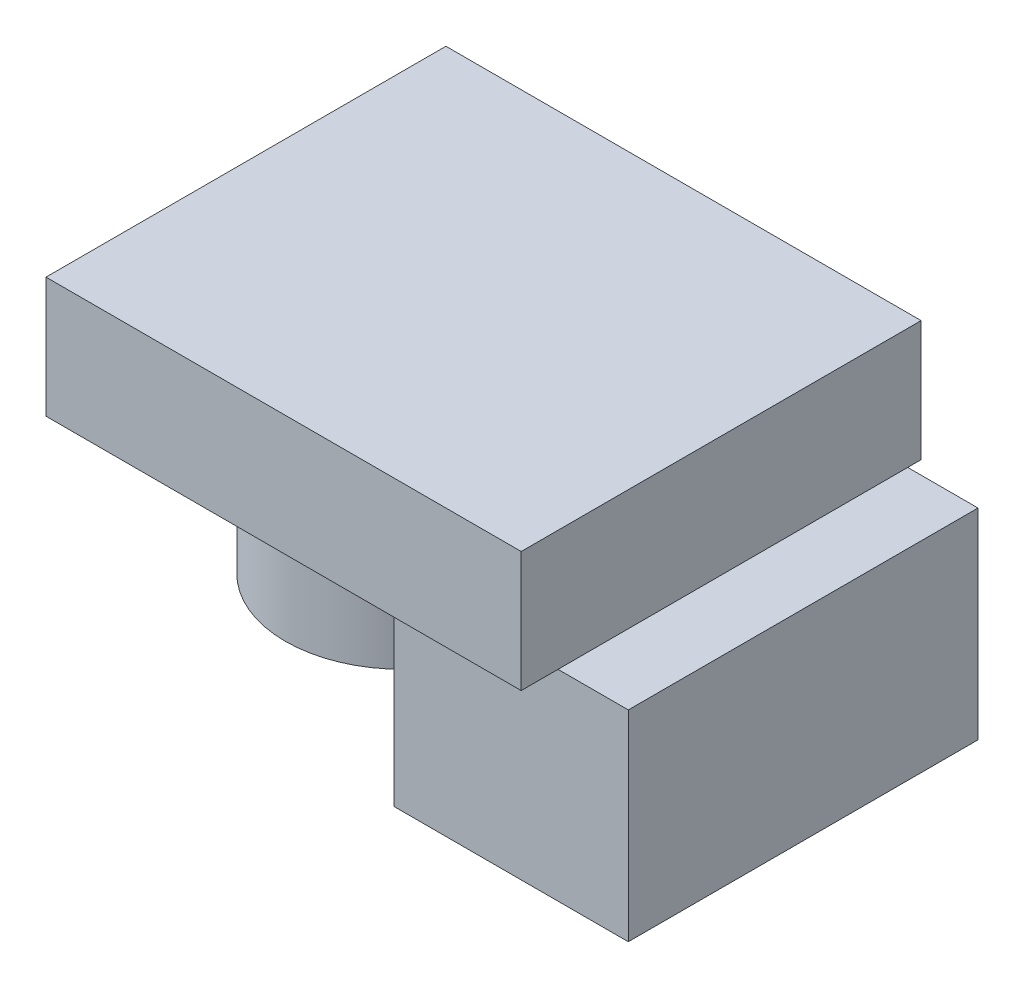
ISO-10303-21;
HEADER;
FILE_DESCRIPTION(('STEP AP214'),'2;1');
FILE_NAME('part.step','',(''),(''),'','','');
FILE_SCHEMA(('AUTOMOTIVE_DESIGN { 1 0 10303 214 1 1 1 1 }'));
ENDSEC;
DATA;
#1=APPLICATION_CONTEXT('core data for automotive mechanical design processes');
#2=APPLICATION_PROTOCOL_DEFINITION('international standard','automotive_design',2000,#1);
#3=PRODUCT_CONTEXT('',#1,'mechanical');
#4=PRODUCT('Part','Part','',(#3));
#5=PRODUCT_RELATED_PRODUCT_CATEGORY('part','',(#4));
#6=PRODUCT_DEFINITION_FORMATION('','',#4);
#7=PRODUCT_DEFINITION_CONTEXT('part definition',#1,'design');
#8=PRODUCT_DEFINITION('design','',#6,#7);
#9=PRODUCT_DEFINITION_SHAPE('','',#8);
#10=(LENGTH_UNIT() NAMED_UNIT(*) SI_UNIT(.MILLI.,.METRE.));
#11=(NAMED_UNIT(*) PLANE_ANGLE_UNIT() SI_UNIT($,.RADIAN.));
#12=(NAMED_UNIT(*) SI_UNIT($,.STERADIAN.) SOLID_ANGLE_UNIT());
#13=UNCERTAINTY_MEASURE_WITH_UNIT(LENGTH_MEASURE(1.E-05),#10,'distance_accuracy_value','');
#14=(GEOMETRIC_REPRESENTATION_CONTEXT(3) GLOBAL_UNCERTAINTY_ASSIGNED_CONTEXT((#13)) GLOBAL_UNIT_ASSIGNED_CONTEXT((#10,
#11,#12)) REPRESENTATION_CONTEXT('',''));
#15=CARTESIAN_POINT('',(0.,0.,0.));
#16=DIRECTION('',(0.,0.,1.));
#17=DIRECTION('',(1.,0.,0.));
#18=AXIS2_PLACEMENT_3D('',#15,#16,#17);
#19=CARTESIAN_POINT('',(0.,5.5,0.));
#20=DIRECTION('',(0.,1.,0.));
#21=DIRECTION('',(0.,0.,1.));
#22=AXIS2_PLACEMENT_3D('',#19,#20,#21);
#23=PLANE('',#22);
#24=CARTESIAN_POINT('',(0.,5.5,0.));
#25=DIRECTION('',(0.,1.,0.));
#26=DIRECTION('',(0.,0.,1.));
#27=AXIS2_PLACEMENT_3D('',#24,#25,#26);
#28=CIRCLE('',#27,3.5);
#29=CARTESIAN_POINT('',(0.,5.5,3.5));
#30=VERTEX_POINT('',#29);
#31=EDGE_CURVE('E54',#30,#30,#28,.T.);
#32=ORIENTED_EDGE('',*,*,#31,.T.);
#33=EDGE_LOOP('',(#32));
#34=FACE_BOUND('',#33,.T.);
#35=DIRECTION('',(-1.,0.,0.));
#36=VECTOR('',#35,1.);
#37=CARTESIAN_POINT('',(5.4,5.5,5.65));
#38=LINE('',#37,#36);
#39=CARTESIAN_POINT('',(10.3,5.5,5.65));
#40=VERTEX_POINT('',#39);
#41=CARTESIAN_POINT('',(5.4,5.5,5.65));
#42=VERTEX_POINT('',#41);
#43=EDGE_CURVE('E11',#40,#42,#38,.T.);
#44=ORIENTED_EDGE('',*,*,#43,.F.);
#45=DIRECTION('',(0.,0.,-1.));
#46=VECTOR('',#45,1.);
#47=CARTESIAN_POINT('',(10.3,5.5,-5.2));
#48=LINE('',#47,#46);
#49=CARTESIAN_POINT('',(10.3,5.5,6.75));
#50=VERTEX_POINT('',#49);
#51=EDGE_CURVE('E172',#50,#40,#48,.T.);
#52=ORIENTED_EDGE('',*,*,#51,.F.);
#53=DIRECTION('',(1.,0.,0.));
#54=VECTOR('',#53,1.);
#55=CARTESIAN_POINT('',(-3.9,5.5,6.75));
#56=LINE('',#55,#54);
#57=CARTESIAN_POINT('',(-3.9,5.5,6.75));
#58=VERTEX_POINT('',#57);
#59=EDGE_CURVE('E146',#58,#50,#56,.T.);
#60=ORIENTED_EDGE('',*,*,#59,.F.);
#61=DIRECTION('',(0.,0.,1.));
#62=VECTOR('',#61,1.);
#63=CARTESIAN_POINT('',(-3.9,5.5,-5.2));
#64=LINE('',#63,#62);
#65=CARTESIAN_POINT('',(-3.9,5.5,-5.2));
#66=VERTEX_POINT('',#65);
#67=EDGE_CURVE('E141',#66,#58,#64,.T.);
#68=ORIENTED_EDGE('',*,*,#67,.F.);
#69=DIRECTION('',(-1.,0.,0.));
#70=VECTOR('',#69,1.);
#71=CARTESIAN_POINT('',(-3.9,5.5,-5.2));
#72=LINE('',#71,#70);
#73=CARTESIAN_POINT('',(10.3,5.5,-5.2));
#74=VERTEX_POINT('',#73);
#75=EDGE_CURVE('E157',#74,#66,#72,.T.);
#76=ORIENTED_EDGE('',*,*,#75,.F.);
#77=CARTESIAN_POINT('',(10.3,5.5,-4.8));
#78=VERTEX_POINT('',#77);
#79=EDGE_CURVE('E67',#78,#74,#48,.T.);
#80=ORIENTED_EDGE('',*,*,#79,.F.);
#81=DIRECTION('',(1.,0.,0.));
#82=VECTOR('',#81,1.);
#83=CARTESIAN_POINT('',(5.4,5.5,-4.8));
#84=LINE('',#83,#82);
#85=CARTESIAN_POINT('',(5.4,5.5,-4.8));
#86=VERTEX_POINT('',#85);
#87=EDGE_CURVE('E258',#86,#78,#84,.T.);
#88=ORIENTED_EDGE('',*,*,#87,.F.);
#89=DIRECTION('',(0.,0.,-1.));
#90=VECTOR('',#89,1.);
#91=CARTESIAN_POINT('',(5.4,5.5,5.65));
#92=LINE('',#91,#90);
#93=EDGE_CURVE('E61',#42,#86,#92,.T.);
#94=ORIENTED_EDGE('',*,*,#93,.F.);
#95=EDGE_LOOP('',(#44,#52,#60,#68,#76,#80,#88,#94));
#96=FACE_BOUND('',#95,.T.);
#97=ADVANCED_FACE('F44',(#34,#96),#23,.F.);
#98=CARTESIAN_POINT('',(0.,5.5,0.));
#99=DIRECTION('',(0.,-1.,0.));
#100=DIRECTION('',(0.,0.,-1.));
#101=AXIS2_PLACEMENT_3D('',#98,#99,#100);
#102=CYLINDRICAL_SURFACE('',#101,3.5);
#103=ORIENTED_EDGE('',*,*,#31,.F.);
#104=EDGE_LOOP('',(#103));
#105=FACE_BOUND('',#104,.T.);
#106=CARTESIAN_POINT('',(0.,0.,0.));
#107=DIRECTION('',(0.,1.,0.));
#108=DIRECTION('',(0.,0.,1.));
#109=AXIS2_PLACEMENT_3D('',#106,#107,#108);
#110=CIRCLE('',#109,3.5);
#111=CARTESIAN_POINT('',(0.,0.,3.5));
#112=VERTEX_POINT('',#111);
#113=EDGE_CURVE('E47',#112,#112,#110,.T.);
#114=ORIENTED_EDGE('',*,*,#113,.T.);
#115=EDGE_LOOP('',(#114));
#116=FACE_BOUND('',#115,.T.);
#117=ADVANCED_FACE('F50',(#105,#116),#102,.T.);
#118=CARTESIAN_POINT('',(0.,0.,0.));
#119=DIRECTION('',(0.,1.,0.));
#120=DIRECTION('',(0.,0.,1.));
#121=AXIS2_PLACEMENT_3D('',#118,#119,#120);
#122=PLANE('',#121);
#123=ORIENTED_EDGE('',*,*,#113,.F.);
#124=EDGE_LOOP('',(#123));
#125=FACE_BOUND('',#124,.T.);
#126=ADVANCED_FACE('F203',(#125),#122,.F.);
#127=CARTESIAN_POINT('',(-3.9,9.1,-5.2));
#128=DIRECTION('',(1.,0.,0.));
#129=DIRECTION('',(0.,0.,-1.));
#130=AXIS2_PLACEMENT_3D('',#127,#128,#129);
#131=PLANE('',#130);
#132=ORIENTED_EDGE('',*,*,#67,.T.);
#133=DIRECTION('',(0.,-1.,0.));
#134=VECTOR('',#133,1.);
#135=CARTESIAN_POINT('',(-3.9,9.1,6.75));
#136=LINE('',#135,#134);
#137=CARTESIAN_POINT('',(-3.9,9.1,6.75));
#138=VERTEX_POINT('',#137);
#139=EDGE_CURVE('E186',#138,#58,#136,.T.);
#140=ORIENTED_EDGE('',*,*,#139,.F.);
#141=DIRECTION('',(0.,0.,1.));
#142=VECTOR('',#141,1.);
#143=CARTESIAN_POINT('',(-3.9,9.1,-5.2));
#144=LINE('',#143,#142);
#145=CARTESIAN_POINT('',(-3.9,9.1,-5.2));
#146=VERTEX_POINT('',#145);
#147=EDGE_CURVE('E152',#146,#138,#144,.T.);
#148=ORIENTED_EDGE('',*,*,#147,.F.);
#149=DIRECTION('',(0.,-1.,0.));
#150=VECTOR('',#149,1.);
#151=CARTESIAN_POINT('',(-3.9,9.1,-5.2));
#152=LINE('',#151,#150);
#153=EDGE_CURVE('E170',#146,#66,#152,.T.);
#154=ORIENTED_EDGE('',*,*,#153,.T.);
#155=EDGE_LOOP('',(#132,#140,#148,#154));
#156=FACE_BOUND('',#155,.T.);
#157=ADVANCED_FACE('F201',(#156),#131,.F.);
#158=CARTESIAN_POINT('',(-3.9,9.1,6.75));
#159=DIRECTION('',(0.,0.,-1.));
#160=DIRECTION('',(-1.,0.,0.));
#161=AXIS2_PLACEMENT_3D('',#158,#159,#160);
#162=PLANE('',#161);
#163=ORIENTED_EDGE('',*,*,#59,.T.);
#164=DIRECTION('',(0.,-1.,0.));
#165=VECTOR('',#164,1.);
#166=CARTESIAN_POINT('',(10.3,9.1,6.75));
#167=LINE('',#166,#165);
#168=CARTESIAN_POINT('',(10.3,9.1,6.75));
#169=VERTEX_POINT('',#168);
#170=EDGE_CURVE('E183',#169,#50,#167,.T.);
#171=ORIENTED_EDGE('',*,*,#170,.F.);
#172=DIRECTION('',(1.,0.,0.));
#173=VECTOR('',#172,1.);
#174=CARTESIAN_POINT('',(-3.9,9.1,6.75));
#175=LINE('',#174,#173);
#176=EDGE_CURVE('E158',#138,#169,#175,.T.);
#177=ORIENTED_EDGE('',*,*,#176,.F.);
#178=ORIENTED_EDGE('',*,*,#139,.T.);
#179=EDGE_LOOP('',(#163,#171,#177,#178));
#180=FACE_BOUND('',#179,.T.);
#181=ADVANCED_FACE('F208',(#180),#162,.F.);
#182=CARTESIAN_POINT('',(10.3,9.1,-5.2));
#183=DIRECTION('',(-1.,0.,0.));
#184=DIRECTION('',(0.,0.,1.));
#185=AXIS2_PLACEMENT_3D('',#182,#183,#184);
#186=PLANE('',#185);
#187=ORIENTED_EDGE('',*,*,#51,.T.);
#188=EDGE_CURVE('E173',#40,#78,#48,.T.);
#189=ORIENTED_EDGE('',*,*,#188,.T.);
#190=ORIENTED_EDGE('',*,*,#79,.T.);
#191=DIRECTION('',(0.,-1.,0.));
#192=VECTOR('',#191,1.);
#193=CARTESIAN_POINT('',(10.3,9.1,-5.2));
#194=LINE('',#193,#192);
#195=CARTESIAN_POINT('',(10.3,9.1,-5.2));
#196=VERTEX_POINT('',#195);
#197=EDGE_CURVE('E182',#196,#74,#194,.T.);
#198=ORIENTED_EDGE('',*,*,#197,.F.);
#199=DIRECTION('',(0.,0.,-1.));
#200=VECTOR('',#199,1.);
#201=CARTESIAN_POINT('',(10.3,9.1,-5.2));
#202=LINE('',#201,#200);
#203=EDGE_CURVE('E165',#169,#196,#202,.T.);
#204=ORIENTED_EDGE('',*,*,#203,.F.);
#205=ORIENTED_EDGE('',*,*,#170,.T.);
#206=EDGE_LOOP('',(#187,#189,#190,#198,#204,#205));
#207=FACE_BOUND('',#206,.T.);
#208=ADVANCED_FACE('F223',(#207),#186,.F.);
#209=CARTESIAN_POINT('',(-3.9,9.1,-5.2));
#210=DIRECTION('',(0.,0.,1.));
#211=DIRECTION('',(1.,0.,0.));
#212=AXIS2_PLACEMENT_3D('',#209,#210,#211);
#213=PLANE('',#212);
#214=ORIENTED_EDGE('',*,*,#75,.T.);
#215=ORIENTED_EDGE('',*,*,#153,.F.);
#216=DIRECTION('',(-1.,0.,0.));
#217=VECTOR('',#216,1.);
#218=CARTESIAN_POINT('',(-3.9,9.1,-5.2));
#219=LINE('',#218,#217);
#220=EDGE_CURVE('E164',#196,#146,#219,.T.);
#221=ORIENTED_EDGE('',*,*,#220,.F.);
#222=ORIENTED_EDGE('',*,*,#197,.T.);
#223=EDGE_LOOP('',(#214,#215,#221,#222));
#224=FACE_BOUND('',#223,.T.);
#225=ADVANCED_FACE('F225',(#224),#213,.F.);
#226=CARTESIAN_POINT('',(0.,9.1,0.));
#227=DIRECTION('',(0.,1.,0.));
#228=DIRECTION('',(0.,0.,1.));
#229=AXIS2_PLACEMENT_3D('',#226,#227,#228);
#230=PLANE('',#229);
#231=ORIENTED_EDGE('',*,*,#147,.T.);
#232=ORIENTED_EDGE('',*,*,#176,.T.);
#233=ORIENTED_EDGE('',*,*,#203,.T.);
#234=ORIENTED_EDGE('',*,*,#220,.T.);
#235=EDGE_LOOP('',(#231,#232,#233,#234));
#236=FACE_BOUND('',#235,.T.);
#237=ADVANCED_FACE('F219',(#236),#230,.T.);
#238=CARTESIAN_POINT('',(5.4,-0.5,5.65));
#239=DIRECTION('',(1.,0.,0.));
#240=DIRECTION('',(0.,0.,-1.));
#241=AXIS2_PLACEMENT_3D('',#238,#239,#240);
#242=PLANE('',#241);
#243=ORIENTED_EDGE('',*,*,#93,.T.);
#244=DIRECTION('',(0.,1.,0.));
#245=VECTOR('',#244,1.);
#246=CARTESIAN_POINT('',(5.4,-0.5,-4.8));
#247=LINE('',#246,#245);
#248=CARTESIAN_POINT('',(5.4,-0.5,-4.8));
#249=VERTEX_POINT('',#248);
#250=EDGE_CURVE('E121',#249,#86,#247,.T.);
#251=ORIENTED_EDGE('',*,*,#250,.F.);
#252=DIRECTION('',(0.,0.,-1.));
#253=VECTOR('',#252,1.);
#254=CARTESIAN_POINT('',(5.4,-0.5,5.65));
#255=LINE('',#254,#253);
#256=CARTESIAN_POINT('',(5.4,-0.5,5.65));
#257=VERTEX_POINT('',#256);
#258=EDGE_CURVE('E128',#257,#249,#255,.T.);
#259=ORIENTED_EDGE('',*,*,#258,.F.);
#260=DIRECTION('',(0.,1.,0.));
#261=VECTOR('',#260,1.);
#262=CARTESIAN_POINT('',(5.4,-0.5,5.65));
#263=LINE('',#262,#261);
#264=EDGE_CURVE('E244',#257,#42,#263,.T.);
#265=ORIENTED_EDGE('',*,*,#264,.T.);
#266=EDGE_LOOP('',(#243,#251,#259,#265));
#267=FACE_BOUND('',#266,.T.);
#268=ADVANCED_FACE('F143',(#267),#242,.F.);
#269=CARTESIAN_POINT('',(5.4,-0.5,-4.8));
#270=DIRECTION('',(0.,0.,1.));
#271=DIRECTION('',(1.,0.,0.));
#272=AXIS2_PLACEMENT_3D('',#269,#270,#271);
#273=PLANE('',#272);
#274=ORIENTED_EDGE('',*,*,#87,.T.);
#275=CARTESIAN_POINT('',(12.4,5.5,-4.8));
#276=VERTEX_POINT('',#275);
#277=EDGE_CURVE('E259',#78,#276,#84,.T.);
#278=ORIENTED_EDGE('',*,*,#277,.T.);
#279=DIRECTION('',(0.,1.,0.));
#280=VECTOR('',#279,1.);
#281=CARTESIAN_POINT('',(12.4,-0.5,-4.8));
#282=LINE('',#281,#280);
#283=CARTESIAN_POINT('',(12.4,-0.5,-4.8));
#284=VERTEX_POINT('',#283);
#285=EDGE_CURVE('E124',#284,#276,#282,.T.);
#286=ORIENTED_EDGE('',*,*,#285,.F.);
#287=DIRECTION('',(1.,0.,0.));
#288=VECTOR('',#287,1.);
#289=CARTESIAN_POINT('',(5.4,-0.5,-4.8));
#290=LINE('',#289,#288);
#291=EDGE_CURVE('E119',#249,#284,#290,.T.);
#292=ORIENTED_EDGE('',*,*,#291,.F.);
#293=ORIENTED_EDGE('',*,*,#250,.T.);
#294=EDGE_LOOP('',(#274,#278,#286,#292,#293));
#295=FACE_BOUND('',#294,.T.);
#296=ADVANCED_FACE('F123',(#295),#273,.F.);
#297=CARTESIAN_POINT('',(12.4,-0.5,5.65));
#298=DIRECTION('',(-1.,0.,0.));
#299=DIRECTION('',(0.,0.,1.));
#300=AXIS2_PLACEMENT_3D('',#297,#298,#299);
#301=PLANE('',#300);
#302=DIRECTION('',(0.,0.,1.));
#303=VECTOR('',#302,1.);
#304=CARTESIAN_POINT('',(12.4,5.5,5.65));
#305=LINE('',#304,#303);
#306=CARTESIAN_POINT('',(12.4,5.5,5.65));
#307=VERTEX_POINT('',#306);
#308=EDGE_CURVE('E251',#276,#307,#305,.T.);
#309=ORIENTED_EDGE('',*,*,#308,.T.);
#310=DIRECTION('',(0.,1.,0.));
#311=VECTOR('',#310,1.);
#312=CARTESIAN_POINT('',(12.4,-0.5,5.65));
#313=LINE('',#312,#311);
#314=CARTESIAN_POINT('',(12.4,-0.5,5.65));
#315=VERTEX_POINT('',#314);
#316=EDGE_CURVE('E147',#315,#307,#313,.T.);
#317=ORIENTED_EDGE('',*,*,#316,.F.);
#318=DIRECTION('',(0.,0.,1.));
#319=VECTOR('',#318,1.);
#320=CARTESIAN_POINT('',(12.4,-0.5,5.65));
#321=LINE('',#320,#319);
#322=EDGE_CURVE('E129',#284,#315,#321,.T.);
#323=ORIENTED_EDGE('',*,*,#322,.F.);
#324=ORIENTED_EDGE('',*,*,#285,.T.);
#325=EDGE_LOOP('',(#309,#317,#323,#324));
#326=FACE_BOUND('',#325,.T.);
#327=ADVANCED_FACE('F264',(#326),#301,.F.);
#328=CARTESIAN_POINT('',(5.4,-0.5,5.65));
#329=DIRECTION('',(0.,0.,-1.));
#330=DIRECTION('',(-1.,0.,0.));
#331=AXIS2_PLACEMENT_3D('',#328,#329,#330);
#332=PLANE('',#331);
#333=EDGE_CURVE('E60',#307,#40,#38,.T.);
#334=ORIENTED_EDGE('',*,*,#333,.T.);
#335=ORIENTED_EDGE('',*,*,#43,.T.);
#336=ORIENTED_EDGE('',*,*,#264,.F.);
#337=DIRECTION('',(-1.,0.,0.));
#338=VECTOR('',#337,1.);
#339=CARTESIAN_POINT('',(5.4,-0.5,5.65));
#340=LINE('',#339,#338);
#341=EDGE_CURVE('E133',#315,#257,#340,.T.);
#342=ORIENTED_EDGE('',*,*,#341,.F.);
#343=ORIENTED_EDGE('',*,*,#316,.T.);
#344=EDGE_LOOP('',(#334,#335,#336,#342,#343));
#345=FACE_BOUND('',#344,.T.);
#346=ADVANCED_FACE('F245',(#345),#332,.F.);
#347=CARTESIAN_POINT('',(0.,-0.5,0.));
#348=DIRECTION('',(0.,-1.,0.));
#349=DIRECTION('',(0.,0.,-1.));
#350=AXIS2_PLACEMENT_3D('',#347,#348,#349);
#351=PLANE('',#350);
#352=ORIENTED_EDGE('',*,*,#258,.T.);
#353=ORIENTED_EDGE('',*,*,#291,.T.);
#354=ORIENTED_EDGE('',*,*,#322,.T.);
#355=ORIENTED_EDGE('',*,*,#341,.T.);
#356=EDGE_LOOP('',(#352,#353,#354,#355));
#357=FACE_BOUND('',#356,.T.);
#358=ADVANCED_FACE('F134',(#357),#351,.T.);
#359=CARTESIAN_POINT('',(0.,5.5,0.));
#360=DIRECTION('',(0.,-1.,0.));
#361=DIRECTION('',(0.,0.,-1.));
#362=AXIS2_PLACEMENT_3D('',#359,#360,#361);
#363=PLANE('',#362);
#364=ORIENTED_EDGE('',*,*,#188,.F.);
#365=ORIENTED_EDGE('',*,*,#333,.F.);
#366=ORIENTED_EDGE('',*,*,#308,.F.);
#367=ORIENTED_EDGE('',*,*,#277,.F.);
#368=EDGE_LOOP('',(#364,#365,#366,#367));
#369=FACE_BOUND('',#368,.T.);
#370=ADVANCED_FACE('F268',(#369),#363,.F.);
#371=CLOSED_SHELL('',(#97,#117,#126,#157,#181,#208,#225,#237,#268,#296,#327,#346,#358,#370));
#372=MANIFOLD_SOLID_BREP('B2',#371);
#373=ADVANCED_BREP_SHAPE_REPRESENTATION('',(#18,#372),#14);
#374=SHAPE_DEFINITION_REPRESENTATION(#9,#373);
ENDSEC;
END-ISO-10303-21;
